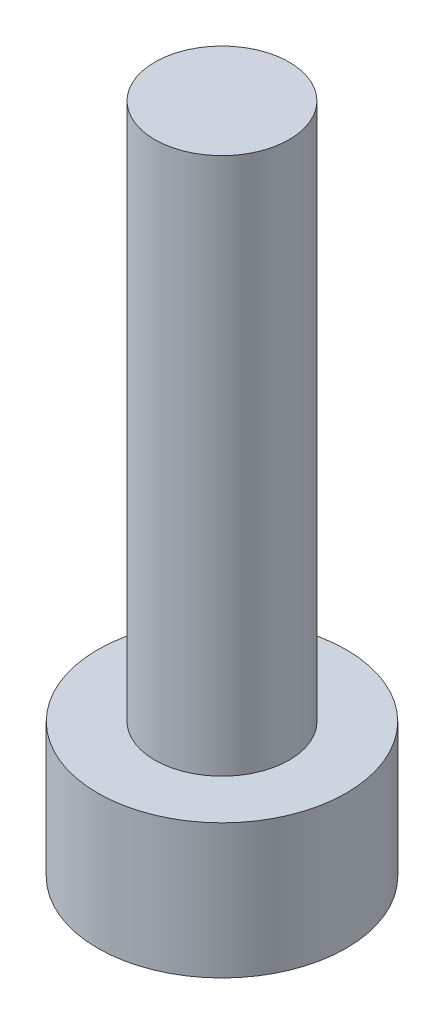
ISO-10303-21;
HEADER;
FILE_DESCRIPTION(('STEP AP214'),'2;1');
FILE_NAME('part.step','',(''),(''),'','','');
FILE_SCHEMA(('AUTOMOTIVE_DESIGN { 1 0 10303 214 1 1 1 1 }'));
ENDSEC;
DATA;
#1=APPLICATION_CONTEXT('core data for automotive mechanical design processes');
#2=APPLICATION_PROTOCOL_DEFINITION('international standard','automotive_design',2000,#1);
#3=PRODUCT_CONTEXT('',#1,'mechanical');
#4=PRODUCT('Part','Part','',(#3));
#5=PRODUCT_RELATED_PRODUCT_CATEGORY('part','',(#4));
#6=PRODUCT_DEFINITION_FORMATION('','',#4);
#7=PRODUCT_DEFINITION_CONTEXT('part definition',#1,'design');
#8=PRODUCT_DEFINITION('design','',#6,#7);
#9=PRODUCT_DEFINITION_SHAPE('','',#8);
#10=(LENGTH_UNIT() NAMED_UNIT(*) SI_UNIT(.MILLI.,.METRE.));
#11=(NAMED_UNIT(*) PLANE_ANGLE_UNIT() SI_UNIT($,.RADIAN.));
#12=(NAMED_UNIT(*) SI_UNIT($,.STERADIAN.) SOLID_ANGLE_UNIT());
#13=UNCERTAINTY_MEASURE_WITH_UNIT(LENGTH_MEASURE(1.E-05),#10,'distance_accuracy_value','');
#14=(GEOMETRIC_REPRESENTATION_CONTEXT(3) GLOBAL_UNCERTAINTY_ASSIGNED_CONTEXT((#13)) GLOBAL_UNIT_ASSIGNED_CONTEXT((#10,
#11,#12)) REPRESENTATION_CONTEXT('',''));
#15=CARTESIAN_POINT('',(0.,0.,0.));
#16=DIRECTION('',(0.,0.,1.));
#17=DIRECTION('',(1.,0.,0.));
#18=AXIS2_PLACEMENT_3D('',#15,#16,#17);
#19=CARTESIAN_POINT('',(0.,2.,0.));
#20=DIRECTION('',(0.,-1.,0.));
#21=DIRECTION('',(0.,0.,-1.));
#22=AXIS2_PLACEMENT_3D('',#19,#20,#21);
#23=CYLINDRICAL_SURFACE('',#22,1.85);
#24=CARTESIAN_POINT('',(0.,2.,0.));
#25=DIRECTION('',(0.,1.,0.));
#26=DIRECTION('',(0.,0.,1.));
#27=AXIS2_PLACEMENT_3D('',#24,#25,#26);
#28=CIRCLE('',#27,1.85);
#29=CARTESIAN_POINT('',(0.,2.,1.85));
#30=VERTEX_POINT('',#29);
#31=EDGE_CURVE('E10',#30,#30,#28,.T.);
#32=ORIENTED_EDGE('',*,*,#31,.F.);
#33=EDGE_LOOP('',(#32));
#34=FACE_BOUND('',#33,.T.);
#35=CARTESIAN_POINT('',(0.,0.,0.));
#36=DIRECTION('',(0.,1.,0.));
#37=DIRECTION('',(0.,0.,1.));
#38=AXIS2_PLACEMENT_3D('',#35,#36,#37);
#39=CIRCLE('',#38,1.85);
#40=CARTESIAN_POINT('',(0.,0.,1.85));
#41=VERTEX_POINT('',#40);
#42=EDGE_CURVE('E33',#41,#41,#39,.T.);
#43=ORIENTED_EDGE('',*,*,#42,.T.);
#44=EDGE_LOOP('',(#43));
#45=FACE_BOUND('',#44,.T.);
#46=ADVANCED_FACE('F30',(#34,#45),#23,.T.);
#47=CARTESIAN_POINT('',(0.,2.,0.));
#48=DIRECTION('',(0.,1.,0.));
#49=DIRECTION('',(0.,0.,1.));
#50=AXIS2_PLACEMENT_3D('',#47,#48,#49);
#51=PLANE('',#50);
#52=CARTESIAN_POINT('',(0.,2.,0.));
#53=DIRECTION('',(0.,1.,0.));
#54=DIRECTION('',(0.,0.,1.));
#55=AXIS2_PLACEMENT_3D('',#52,#53,#54);
#56=CIRCLE('',#55,1.);
#57=CARTESIAN_POINT('',(0.,2.,1.));
#58=VERTEX_POINT('',#57);
#59=EDGE_CURVE('E42',#58,#58,#56,.T.);
#60=ORIENTED_EDGE('',*,*,#59,.F.);
#61=EDGE_LOOP('',(#60));
#62=FACE_BOUND('',#61,.T.);
#63=ORIENTED_EDGE('',*,*,#31,.T.);
#64=EDGE_LOOP('',(#63));
#65=FACE_BOUND('',#64,.T.);
#66=ADVANCED_FACE('F57',(#62,#65),#51,.T.);
#67=CARTESIAN_POINT('',(0.,0.,0.));
#68=DIRECTION('',(0.,1.,0.));
#69=DIRECTION('',(0.,0.,1.));
#70=AXIS2_PLACEMENT_3D('',#67,#68,#69);
#71=PLANE('',#70);
#72=ORIENTED_EDGE('',*,*,#42,.F.);
#73=EDGE_LOOP('',(#72));
#74=FACE_BOUND('',#73,.T.);
#75=ADVANCED_FACE('F53',(#74),#71,.F.);
#76=CARTESIAN_POINT('',(0.,10.,0.));
#77=DIRECTION('',(0.,-1.,0.));
#78=DIRECTION('',(0.,0.,-1.));
#79=AXIS2_PLACEMENT_3D('',#76,#77,#78);
#80=CYLINDRICAL_SURFACE('',#79,1.);
#81=CARTESIAN_POINT('',(0.,10.,0.));
#82=DIRECTION('',(0.,1.,0.));
#83=DIRECTION('',(0.,0.,1.));
#84=AXIS2_PLACEMENT_3D('',#81,#82,#83);
#85=CIRCLE('',#84,1.);
#86=CARTESIAN_POINT('',(0.,10.,1.));
#87=VERTEX_POINT('',#86);
#88=EDGE_CURVE('E40',#87,#87,#85,.T.);
#89=ORIENTED_EDGE('',*,*,#88,.F.);
#90=EDGE_LOOP('',(#89));
#91=FACE_BOUND('',#90,.T.);
#92=ORIENTED_EDGE('',*,*,#59,.T.);
#93=EDGE_LOOP('',(#92));
#94=FACE_BOUND('',#93,.T.);
#95=ADVANCED_FACE('F50',(#91,#94),#80,.T.);
#96=CARTESIAN_POINT('',(0.,10.,0.));
#97=DIRECTION('',(0.,1.,0.));
#98=DIRECTION('',(0.,0.,1.));
#99=AXIS2_PLACEMENT_3D('',#96,#97,#98);
#100=PLANE('',#99);
#101=ORIENTED_EDGE('',*,*,#88,.T.);
#102=EDGE_LOOP('',(#101));
#103=FACE_BOUND('',#102,.T.);
#104=ADVANCED_FACE('F48',(#103),#100,.T.);
#105=CLOSED_SHELL('',(#46,#66,#75,#95,#104));
#106=MANIFOLD_SOLID_BREP('B2',#105);
#107=ADVANCED_BREP_SHAPE_REPRESENTATION('',(#18,#106),#14);
#108=SHAPE_DEFINITION_REPRESENTATION(#9,#107);
ENDSEC;
END-ISO-10303-21;
